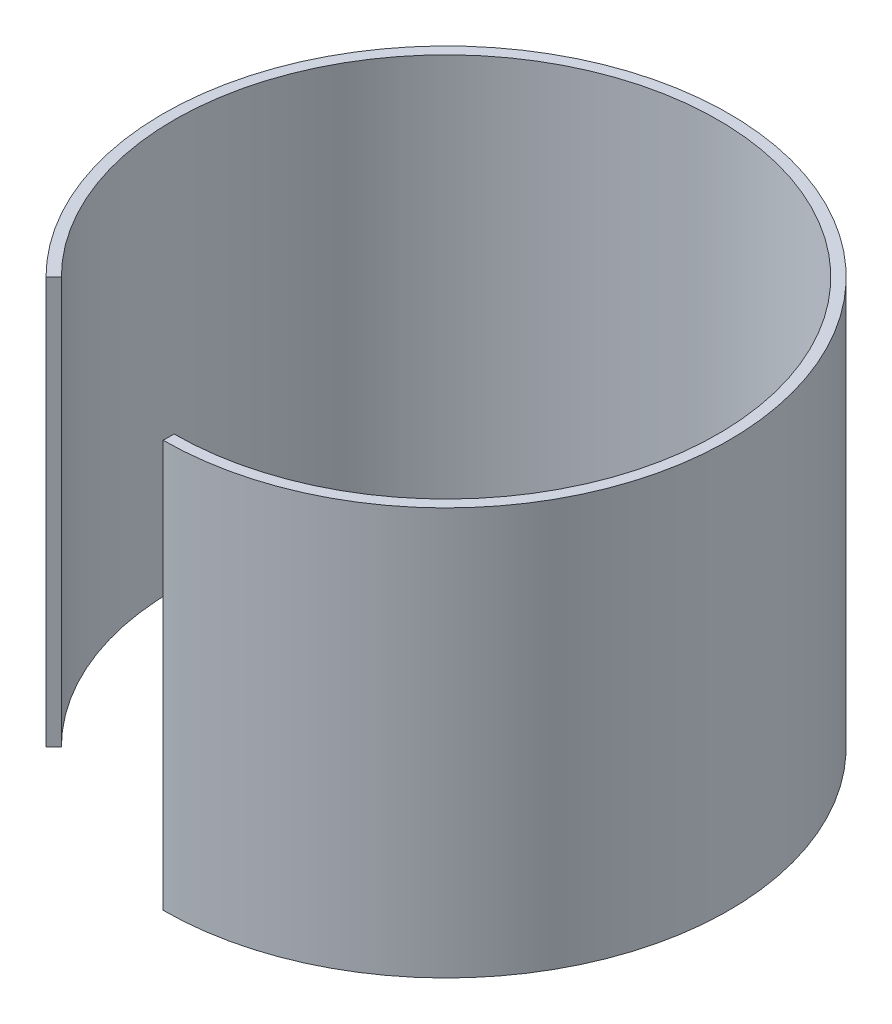
ISO-10303-21;
HEADER;
FILE_DESCRIPTION(('STEP AP214'),'2;1');
FILE_NAME('part.step','',(''),(''),'','','');
FILE_SCHEMA(('AUTOMOTIVE_DESIGN { 1 0 10303 214 1 1 1 1 }'));
ENDSEC;
DATA;
#1=APPLICATION_CONTEXT('core data for automotive mechanical design processes');
#2=APPLICATION_PROTOCOL_DEFINITION('international standard','automotive_design',2000,#1);
#3=PRODUCT_CONTEXT('',#1,'mechanical');
#4=PRODUCT('Part','Part','',(#3));
#5=PRODUCT_RELATED_PRODUCT_CATEGORY('part','',(#4));
#6=PRODUCT_DEFINITION_FORMATION('','',#4);
#7=PRODUCT_DEFINITION_CONTEXT('part definition',#1,'design');
#8=PRODUCT_DEFINITION('design','',#6,#7);
#9=PRODUCT_DEFINITION_SHAPE('','',#8);
#10=(LENGTH_UNIT() NAMED_UNIT(*) SI_UNIT(.MILLI.,.METRE.));
#11=(NAMED_UNIT(*) PLANE_ANGLE_UNIT() SI_UNIT($,.RADIAN.));
#12=(NAMED_UNIT(*) SI_UNIT($,.STERADIAN.) SOLID_ANGLE_UNIT());
#13=UNCERTAINTY_MEASURE_WITH_UNIT(LENGTH_MEASURE(1.E-05),#10,'distance_accuracy_value','');
#14=(GEOMETRIC_REPRESENTATION_CONTEXT(3) GLOBAL_UNCERTAINTY_ASSIGNED_CONTEXT((#13)) GLOBAL_UNIT_ASSIGNED_CONTEXT((#10,
#11,#12)) REPRESENTATION_CONTEXT('',''));
#15=CARTESIAN_POINT('',(0.,0.,0.));
#16=DIRECTION('',(0.,0.,1.));
#17=DIRECTION('',(1.,0.,0.));
#18=AXIS2_PLACEMENT_3D('',#15,#16,#17);
#19=CARTESIAN_POINT('',(0.,75.,0.));
#20=DIRECTION('',(0.,-1.,0.));
#21=DIRECTION('',(0.,0.,-1.));
#22=AXIS2_PLACEMENT_3D('',#19,#20,#21);
#23=CYLINDRICAL_SURFACE('',#22,50.12);
#24=CARTESIAN_POINT('',(0.,0.,0.));
#25=DIRECTION('',(0.,-1.,0.));
#26=DIRECTION('',(0.,0.,1.));
#27=AXIS2_PLACEMENT_3D('',#24,#25,#26);
#28=CIRCLE('',#27,50.12);
#29=CARTESIAN_POINT('',(-35.4401918730698,0.,35.4401918730697));
#30=VERTEX_POINT('',#29);
#31=CARTESIAN_POINT('',(0.,0.,50.12));
#32=VERTEX_POINT('',#31);
#33=EDGE_CURVE('E95',#30,#32,#28,.T.);
#34=ORIENTED_EDGE('',*,*,#33,.T.);
#35=DIRECTION('',(0.,-1.,0.));
#36=VECTOR('',#35,1.);
#37=CARTESIAN_POINT('',(0.,75.,50.12));
#38=LINE('',#37,#36);
#39=CARTESIAN_POINT('',(0.,75.,50.12));
#40=VERTEX_POINT('',#39);
#41=EDGE_CURVE('E11',#40,#32,#38,.T.);
#42=ORIENTED_EDGE('',*,*,#41,.F.);
#43=CARTESIAN_POINT('',(0.,75.,0.));
#44=DIRECTION('',(0.,-1.,0.));
#45=DIRECTION('',(0.,0.,1.));
#46=AXIS2_PLACEMENT_3D('',#43,#44,#45);
#47=CIRCLE('',#46,50.12);
#48=CARTESIAN_POINT('',(-35.4401918730698,75.,35.4401918730697));
#49=VERTEX_POINT('',#48);
#50=EDGE_CURVE('E83',#49,#40,#47,.T.);
#51=ORIENTED_EDGE('',*,*,#50,.F.);
#52=DIRECTION('',(0.,-1.,0.));
#53=VECTOR('',#52,1.);
#54=CARTESIAN_POINT('',(-35.4401918730698,75.,35.4401918730697));
#55=LINE('',#54,#53);
#56=EDGE_CURVE('E91',#49,#30,#55,.T.);
#57=ORIENTED_EDGE('',*,*,#56,.T.);
#58=EDGE_LOOP('',(#34,#42,#51,#57));
#59=FACE_BOUND('',#58,.T.);
#60=ADVANCED_FACE('F32',(#59),#23,.F.);
#61=CARTESIAN_POINT('',(0.,75.,50.12));
#62=DIRECTION('',(1.,0.,0.));
#63=DIRECTION('',(0.,0.,-1.));
#64=AXIS2_PLACEMENT_3D('',#61,#62,#63);
#65=PLANE('',#64);
#66=DIRECTION('',(0.,0.,1.));
#67=VECTOR('',#66,1.);
#68=CARTESIAN_POINT('',(0.,0.,50.12));
#69=LINE('',#68,#67);
#70=CARTESIAN_POINT('',(0.,0.,52.12));
#71=VERTEX_POINT('',#70);
#72=EDGE_CURVE('E87',#32,#71,#69,.T.);
#73=ORIENTED_EDGE('',*,*,#72,.T.);
#74=DIRECTION('',(0.,-1.,0.));
#75=VECTOR('',#74,1.);
#76=CARTESIAN_POINT('',(0.,75.,52.12));
#77=LINE('',#76,#75);
#78=CARTESIAN_POINT('',(0.,75.,52.12));
#79=VERTEX_POINT('',#78);
#80=EDGE_CURVE('E40',#79,#71,#77,.T.);
#81=ORIENTED_EDGE('',*,*,#80,.F.);
#82=DIRECTION('',(0.,0.,1.));
#83=VECTOR('',#82,1.);
#84=CARTESIAN_POINT('',(0.,75.,50.12));
#85=LINE('',#84,#83);
#86=EDGE_CURVE('E78',#40,#79,#85,.T.);
#87=ORIENTED_EDGE('',*,*,#86,.F.);
#88=ORIENTED_EDGE('',*,*,#41,.T.);
#89=EDGE_LOOP('',(#73,#81,#87,#88));
#90=FACE_BOUND('',#89,.T.);
#91=ADVANCED_FACE('F86',(#90),#65,.F.);
#92=CARTESIAN_POINT('',(0.,75.,0.));
#93=DIRECTION('',(0.,-1.,0.));
#94=DIRECTION('',(0.,0.,-1.));
#95=AXIS2_PLACEMENT_3D('',#92,#93,#94);
#96=CYLINDRICAL_SURFACE('',#95,52.12);
#97=CARTESIAN_POINT('',(0.,0.,0.));
#98=DIRECTION('',(0.,1.,0.));
#99=DIRECTION('',(0.,0.,1.));
#100=AXIS2_PLACEMENT_3D('',#97,#98,#99);
#101=CIRCLE('',#100,52.12);
#102=CARTESIAN_POINT('',(-36.8544054354429,0.,36.8544054354428));
#103=VERTEX_POINT('',#102);
#104=EDGE_CURVE('E65',#71,#103,#101,.T.);
#105=ORIENTED_EDGE('',*,*,#104,.T.);
#106=DIRECTION('',(0.,-1.,0.));
#107=VECTOR('',#106,1.);
#108=CARTESIAN_POINT('',(-36.8544054354429,75.,36.8544054354428));
#109=LINE('',#108,#107);
#110=CARTESIAN_POINT('',(-36.8544054354429,75.,36.8544054354428));
#111=VERTEX_POINT('',#110);
#112=EDGE_CURVE('E88',#111,#103,#109,.T.);
#113=ORIENTED_EDGE('',*,*,#112,.F.);
#114=CARTESIAN_POINT('',(0.,75.,0.));
#115=DIRECTION('',(0.,1.,0.));
#116=DIRECTION('',(0.,0.,1.));
#117=AXIS2_PLACEMENT_3D('',#114,#115,#116);
#118=CIRCLE('',#117,52.12);
#119=EDGE_CURVE('E81',#79,#111,#118,.T.);
#120=ORIENTED_EDGE('',*,*,#119,.F.);
#121=ORIENTED_EDGE('',*,*,#80,.T.);
#122=EDGE_LOOP('',(#105,#113,#120,#121));
#123=FACE_BOUND('',#122,.T.);
#124=ADVANCED_FACE('F89',(#123),#96,.T.);
#125=CARTESIAN_POINT('',(-35.4401918730698,75.,35.4401918730697));
#126=DIRECTION('',(-0.707106781186542,0.,-0.707106781186553));
#127=DIRECTION('',(-0.707106781186553,0.,0.707106781186542));
#128=AXIS2_PLACEMENT_3D('',#125,#126,#127);
#129=PLANE('',#128);
#130=DIRECTION('',(0.707106781186553,0.,-0.707106781186542));
#131=VECTOR('',#130,1.);
#132=CARTESIAN_POINT('',(-35.4401918730698,0.,35.4401918730697));
#133=LINE('',#132,#131);
#134=EDGE_CURVE('E71',#103,#30,#133,.T.);
#135=ORIENTED_EDGE('',*,*,#134,.T.);
#136=ORIENTED_EDGE('',*,*,#56,.F.);
#137=DIRECTION('',(0.707106781186553,0.,-0.707106781186542));
#138=VECTOR('',#137,1.);
#139=CARTESIAN_POINT('',(-35.4401918730698,75.,35.4401918730697));
#140=LINE('',#139,#138);
#141=EDGE_CURVE('E48',#111,#49,#140,.T.);
#142=ORIENTED_EDGE('',*,*,#141,.F.);
#143=ORIENTED_EDGE('',*,*,#112,.T.);
#144=EDGE_LOOP('',(#135,#136,#142,#143));
#145=FACE_BOUND('',#144,.T.);
#146=ADVANCED_FACE('F102',(#145),#129,.F.);
#147=CARTESIAN_POINT('',(0.,75.,0.));
#148=DIRECTION('',(0.,1.,0.));
#149=DIRECTION('',(0.,0.,1.));
#150=AXIS2_PLACEMENT_3D('',#147,#148,#149);
#151=PLANE('',#150);
#152=ORIENTED_EDGE('',*,*,#50,.T.);
#153=ORIENTED_EDGE('',*,*,#86,.T.);
#154=ORIENTED_EDGE('',*,*,#119,.T.);
#155=ORIENTED_EDGE('',*,*,#141,.T.);
#156=EDGE_LOOP('',(#152,#153,#154,#155));
#157=FACE_BOUND('',#156,.T.);
#158=ADVANCED_FACE('F79',(#157),#151,.T.);
#159=CARTESIAN_POINT('',(0.,0.,0.));
#160=DIRECTION('',(0.,1.,0.));
#161=DIRECTION('',(0.,0.,1.));
#162=AXIS2_PLACEMENT_3D('',#159,#160,#161);
#163=PLANE('',#162);
#164=ORIENTED_EDGE('',*,*,#33,.F.);
#165=ORIENTED_EDGE('',*,*,#134,.F.);
#166=ORIENTED_EDGE('',*,*,#104,.F.);
#167=ORIENTED_EDGE('',*,*,#72,.F.);
#168=EDGE_LOOP('',(#164,#165,#166,#167));
#169=FACE_BOUND('',#168,.T.);
#170=ADVANCED_FACE('F105',(#169),#163,.F.);
#171=CLOSED_SHELL('',(#60,#91,#124,#146,#158,#170));
#172=MANIFOLD_SOLID_BREP('B2',#171);
#173=ADVANCED_BREP_SHAPE_REPRESENTATION('',(#18,#172),#14);
#174=SHAPE_DEFINITION_REPRESENTATION(#9,#173);
ENDSEC;
END-ISO-10303-21;
